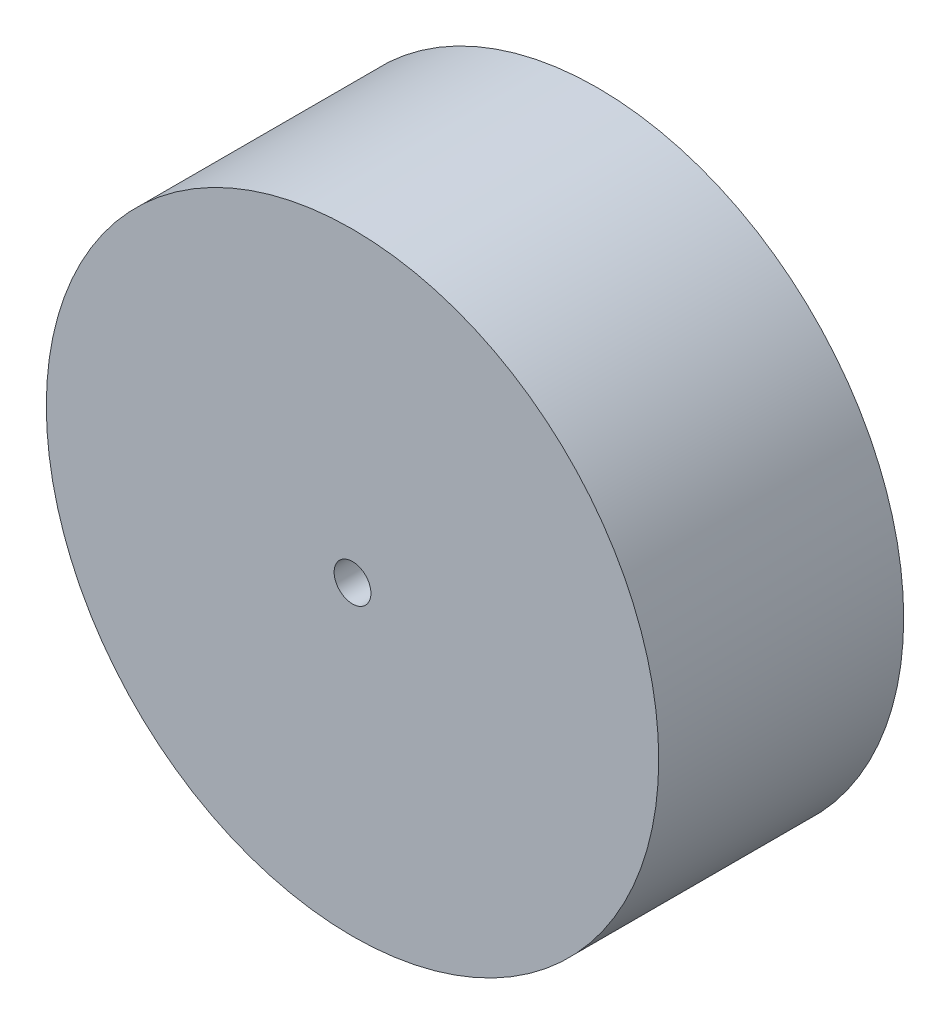
ISO-10303-21;
HEADER;
FILE_DESCRIPTION(('STEP AP214'),'2;1');
FILE_NAME('part.step','',(''),(''),'','','');
FILE_SCHEMA(('AUTOMOTIVE_DESIGN { 1 0 10303 214 1 1 1 1 }'));
ENDSEC;
DATA;
#1=APPLICATION_CONTEXT('core data for automotive mechanical design processes');
#2=APPLICATION_PROTOCOL_DEFINITION('international standard','automotive_design',2000,#1);
#3=PRODUCT_CONTEXT('',#1,'mechanical');
#4=PRODUCT('Part','Part','',(#3));
#5=PRODUCT_RELATED_PRODUCT_CATEGORY('part','',(#4));
#6=PRODUCT_DEFINITION_FORMATION('','',#4);
#7=PRODUCT_DEFINITION_CONTEXT('part definition',#1,'design');
#8=PRODUCT_DEFINITION('design','',#6,#7);
#9=PRODUCT_DEFINITION_SHAPE('','',#8);
#10=(LENGTH_UNIT() NAMED_UNIT(*) SI_UNIT(.MILLI.,.METRE.));
#11=(NAMED_UNIT(*) PLANE_ANGLE_UNIT() SI_UNIT($,.RADIAN.));
#12=(NAMED_UNIT(*) SI_UNIT($,.STERADIAN.) SOLID_ANGLE_UNIT());
#13=UNCERTAINTY_MEASURE_WITH_UNIT(LENGTH_MEASURE(1.E-05),#10,'distance_accuracy_value','');
#14=(GEOMETRIC_REPRESENTATION_CONTEXT(3) GLOBAL_UNCERTAINTY_ASSIGNED_CONTEXT((#13)) GLOBAL_UNIT_ASSIGNED_CONTEXT((#10,
#11,#12)) REPRESENTATION_CONTEXT('',''));
#15=CARTESIAN_POINT('',(0.,0.,0.));
#16=DIRECTION('',(0.,0.,1.));
#17=DIRECTION('',(1.,0.,0.));
#18=AXIS2_PLACEMENT_3D('',#15,#16,#17);
#19=CARTESIAN_POINT('',(0.,0.,40.));
#20=DIRECTION('',(0.,0.,-1.));
#21=DIRECTION('',(-1.,0.,0.));
#22=AXIS2_PLACEMENT_3D('',#19,#20,#21);
#23=CYLINDRICAL_SURFACE('',#22,50.);
#24=CARTESIAN_POINT('',(0.,0.,40.));
#25=DIRECTION('',(0.,0.,1.));
#26=DIRECTION('',(1.,0.,0.));
#27=AXIS2_PLACEMENT_3D('',#24,#25,#26);
#28=CIRCLE('',#27,50.);
#29=CARTESIAN_POINT('',(50.,0.,40.));
#30=VERTEX_POINT('',#29);
#31=EDGE_CURVE('E10',#30,#30,#28,.T.);
#32=ORIENTED_EDGE('',*,*,#31,.F.);
#33=EDGE_LOOP('',(#32));
#34=FACE_BOUND('',#33,.T.);
#35=CARTESIAN_POINT('',(0.,0.,0.));
#36=DIRECTION('',(0.,0.,1.));
#37=DIRECTION('',(1.,0.,0.));
#38=AXIS2_PLACEMENT_3D('',#35,#36,#37);
#39=CIRCLE('',#38,50.);
#40=CARTESIAN_POINT('',(50.,0.,0.));
#41=VERTEX_POINT('',#40);
#42=EDGE_CURVE('E35',#41,#41,#39,.T.);
#43=ORIENTED_EDGE('',*,*,#42,.T.);
#44=EDGE_LOOP('',(#43));
#45=FACE_BOUND('',#44,.T.);
#46=ADVANCED_FACE('F32',(#34,#45),#23,.T.);
#47=CARTESIAN_POINT('',(0.,0.,40.));
#48=DIRECTION('',(0.,0.,1.));
#49=DIRECTION('',(1.,0.,0.));
#50=AXIS2_PLACEMENT_3D('',#47,#48,#49);
#51=PLANE('',#50);
#52=CARTESIAN_POINT('',(0.,0.,40.));
#53=DIRECTION('',(0.,0.,1.));
#54=DIRECTION('',(1.,0.,0.));
#55=AXIS2_PLACEMENT_3D('',#52,#53,#54);
#56=CIRCLE('',#55,3.);
#57=CARTESIAN_POINT('',(3.,0.,40.));
#58=VERTEX_POINT('',#57);
#59=EDGE_CURVE('E42',#58,#58,#56,.T.);
#60=ORIENTED_EDGE('',*,*,#59,.F.);
#61=EDGE_LOOP('',(#60));
#62=FACE_BOUND('',#61,.T.);
#63=ORIENTED_EDGE('',*,*,#31,.T.);
#64=EDGE_LOOP('',(#63));
#65=FACE_BOUND('',#64,.T.);
#66=ADVANCED_FACE('F55',(#62,#65),#51,.T.);
#67=CARTESIAN_POINT('',(0.,0.,0.));
#68=DIRECTION('',(0.,0.,1.));
#69=DIRECTION('',(1.,0.,0.));
#70=AXIS2_PLACEMENT_3D('',#67,#68,#69);
#71=PLANE('',#70);
#72=CARTESIAN_POINT('',(0.,0.,0.));
#73=DIRECTION('',(0.,0.,-1.));
#74=DIRECTION('',(-1.,0.,0.));
#75=AXIS2_PLACEMENT_3D('',#72,#73,#74);
#76=CIRCLE('',#75,3.);
#77=CARTESIAN_POINT('',(-3.,0.,0.));
#78=VERTEX_POINT('',#77);
#79=EDGE_CURVE('E46',#78,#78,#76,.T.);
#80=ORIENTED_EDGE('',*,*,#79,.F.);
#81=EDGE_LOOP('',(#80));
#82=FACE_BOUND('',#81,.T.);
#83=ORIENTED_EDGE('',*,*,#42,.F.);
#84=EDGE_LOOP('',(#83));
#85=FACE_BOUND('',#84,.T.);
#86=ADVANCED_FACE('F52',(#82,#85),#71,.F.);
#87=CARTESIAN_POINT('',(0.,0.,50.));
#88=DIRECTION('',(0.,0.,-1.));
#89=DIRECTION('',(-1.,0.,0.));
#90=AXIS2_PLACEMENT_3D('',#87,#88,#89);
#91=CYLINDRICAL_SURFACE('',#90,3.);
#92=ORIENTED_EDGE('',*,*,#59,.T.);
#93=EDGE_LOOP('',(#92));
#94=FACE_BOUND('',#93,.T.);
#95=ORIENTED_EDGE('',*,*,#79,.T.);
#96=EDGE_LOOP('',(#95));
#97=FACE_BOUND('',#96,.T.);
#98=ADVANCED_FACE('F50',(#94,#97),#91,.F.);
#99=CLOSED_SHELL('',(#46,#66,#86,#98));
#100=MANIFOLD_SOLID_BREP('B2',#99);
#101=ADVANCED_BREP_SHAPE_REPRESENTATION('',(#18,#100),#14);
#102=SHAPE_DEFINITION_REPRESENTATION(#9,#101);
ENDSEC;
END-ISO-10303-21;
